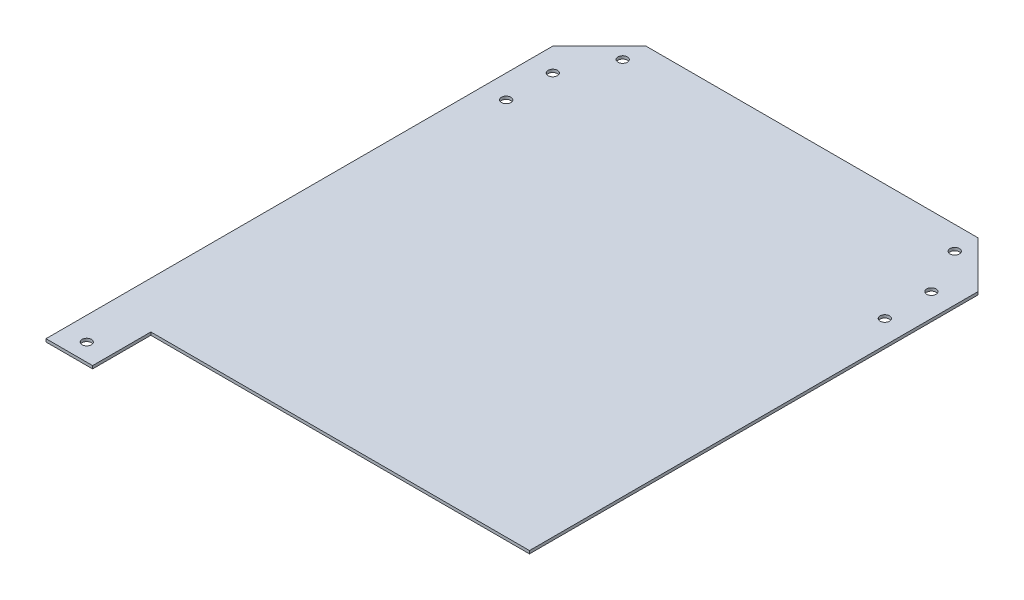
ISO-10303-21;
HEADER;
FILE_DESCRIPTION(('STEP AP214'),'2;1');
FILE_NAME('part.step','',(''),(''),'','','');
FILE_SCHEMA(('AUTOMOTIVE_DESIGN { 1 0 10303 214 1 1 1 1 }'));
ENDSEC;
DATA;
#1=APPLICATION_CONTEXT('core data for automotive mechanical design processes');
#2=APPLICATION_PROTOCOL_DEFINITION('international standard','automotive_design',2000,#1);
#3=PRODUCT_CONTEXT('',#1,'mechanical');
#4=PRODUCT('Part','Part','',(#3));
#5=PRODUCT_RELATED_PRODUCT_CATEGORY('part','',(#4));
#6=PRODUCT_DEFINITION_FORMATION('','',#4);
#7=PRODUCT_DEFINITION_CONTEXT('part definition',#1,'design');
#8=PRODUCT_DEFINITION('design','',#6,#7);
#9=PRODUCT_DEFINITION_SHAPE('','',#8);
#10=(LENGTH_UNIT() NAMED_UNIT(*) SI_UNIT(.MILLI.,.METRE.));
#11=(NAMED_UNIT(*) PLANE_ANGLE_UNIT() SI_UNIT($,.RADIAN.));
#12=(NAMED_UNIT(*) SI_UNIT($,.STERADIAN.) SOLID_ANGLE_UNIT());
#13=UNCERTAINTY_MEASURE_WITH_UNIT(LENGTH_MEASURE(1.E-05),#10,'distance_accuracy_value','');
#14=(GEOMETRIC_REPRESENTATION_CONTEXT(3) GLOBAL_UNCERTAINTY_ASSIGNED_CONTEXT((#13)) GLOBAL_UNIT_ASSIGNED_CONTEXT((#10,
#11,#12)) REPRESENTATION_CONTEXT('',''));
#15=CARTESIAN_POINT('',(0.,0.,0.));
#16=DIRECTION('',(0.,0.,1.));
#17=DIRECTION('',(1.,0.,0.));
#18=AXIS2_PLACEMENT_3D('',#15,#16,#17);
#19=CARTESIAN_POINT('',(-70.7565046605173,1.5875,3.62153533205063));
#20=DIRECTION('',(0.,0.,-1.));
#21=DIRECTION('',(-1.,0.,0.));
#22=AXIS2_PLACEMENT_3D('',#19,#20,#21);
#23=PLANE('',#22);
#24=DIRECTION('',(1.,0.,0.));
#25=VECTOR('',#24,1.);
#26=CARTESIAN_POINT('',(-70.7565046605173,0.,3.62153533205063));
#27=LINE('',#26,#25);
#28=CARTESIAN_POINT('',(-70.7565046605173,0.,3.62153533205063));
#29=VERTEX_POINT('',#28);
#30=CARTESIAN_POINT('',(135.6184958429,0.,3.62153533205063));
#31=VERTEX_POINT('',#30);
#32=EDGE_CURVE('E133',#29,#31,#27,.T.);
#33=ORIENTED_EDGE('',*,*,#32,.T.);
#34=DIRECTION('',(0.,-1.,0.));
#35=VECTOR('',#34,1.);
#36=CARTESIAN_POINT('',(135.6184958429,1.5875,3.62153533205063));
#37=LINE('',#36,#35);
#38=CARTESIAN_POINT('',(135.6184958429,1.5875,3.62153533205063));
#39=VERTEX_POINT('',#38);
#40=EDGE_CURVE('E11',#39,#31,#37,.T.);
#41=ORIENTED_EDGE('',*,*,#40,.F.);
#42=DIRECTION('',(1.,0.,0.));
#43=VECTOR('',#42,1.);
#44=CARTESIAN_POINT('',(-70.7565046605173,1.5875,3.62153533205063));
#45=LINE('',#44,#43);
#46=CARTESIAN_POINT('',(-70.7565046605173,1.5875,3.62153533205063));
#47=VERTEX_POINT('',#46);
#48=EDGE_CURVE('E148',#47,#39,#45,.T.);
#49=ORIENTED_EDGE('',*,*,#48,.F.);
#50=DIRECTION('',(0.,-1.,0.));
#51=VECTOR('',#50,1.);
#52=CARTESIAN_POINT('',(-70.7565046605173,1.5875,3.62153533205063));
#53=LINE('',#52,#51);
#54=EDGE_CURVE('E129',#47,#29,#53,.T.);
#55=ORIENTED_EDGE('',*,*,#54,.T.);
#56=EDGE_LOOP('',(#33,#41,#49,#55));
#57=FACE_BOUND('',#56,.T.);
#58=ADVANCED_FACE('F37',(#57),#23,.F.);
#59=CARTESIAN_POINT('',(135.6184958429,1.5875,3.62153533205063));
#60=DIRECTION('',(-1.,0.,0.));
#61=DIRECTION('',(0.,0.,1.));
#62=AXIS2_PLACEMENT_3D('',#59,#60,#61);
#63=PLANE('',#62);
#64=DIRECTION('',(0.,0.,-1.));
#65=VECTOR('',#64,1.);
#66=CARTESIAN_POINT('',(135.6184958429,0.,3.62153533205063));
#67=LINE('',#66,#65);
#68=CARTESIAN_POINT('',(135.6184958429,0.,-240.85346466795));
#69=VERTEX_POINT('',#68);
#70=EDGE_CURVE('E136',#31,#69,#67,.T.);
#71=ORIENTED_EDGE('',*,*,#70,.T.);
#72=DIRECTION('',(0.,-1.,0.));
#73=VECTOR('',#72,1.);
#74=CARTESIAN_POINT('',(135.6184958429,1.5875,-240.85346466795));
#75=LINE('',#74,#73);
#76=CARTESIAN_POINT('',(135.6184958429,1.5875,-240.85346466795));
#77=VERTEX_POINT('',#76);
#78=EDGE_CURVE('E45',#77,#69,#75,.T.);
#79=ORIENTED_EDGE('',*,*,#78,.F.);
#80=DIRECTION('',(0.,0.,-1.));
#81=VECTOR('',#80,1.);
#82=CARTESIAN_POINT('',(135.6184958429,1.5875,3.62153533205063));
#83=LINE('',#82,#81);
#84=EDGE_CURVE('E96',#39,#77,#83,.T.);
#85=ORIENTED_EDGE('',*,*,#84,.F.);
#86=ORIENTED_EDGE('',*,*,#40,.T.);
#87=EDGE_LOOP('',(#71,#79,#85,#86));
#88=FACE_BOUND('',#87,.T.);
#89=ADVANCED_FACE('F257',(#88),#63,.F.);
#90=CARTESIAN_POINT('',(135.6184958429,1.5875,-240.85346466795));
#91=DIRECTION('',(-0.707106781186544,0.,0.707106781186551));
#92=DIRECTION('',(0.707106781186551,0.,0.707106781186544));
#93=AXIS2_PLACEMENT_3D('',#90,#91,#92);
#94=PLANE('',#93);
#95=DIRECTION('',(-0.707106781186551,0.,-0.707106781186544));
#96=VECTOR('',#95,1.);
#97=CARTESIAN_POINT('',(135.6184958429,0.,-240.85346466795));
#98=LINE('',#97,#96);
#99=CARTESIAN_POINT('',(110.2184958429,0.,-266.25346466795));
#100=VERTEX_POINT('',#99);
#101=EDGE_CURVE('E139',#69,#100,#98,.T.);
#102=ORIENTED_EDGE('',*,*,#101,.T.);
#103=DIRECTION('',(0.,-1.,0.));
#104=VECTOR('',#103,1.);
#105=CARTESIAN_POINT('',(110.2184958429,1.5875,-266.25346466795));
#106=LINE('',#105,#104);
#107=CARTESIAN_POINT('',(110.2184958429,1.5875,-266.25346466795));
#108=VERTEX_POINT('',#107);
#109=EDGE_CURVE('E155',#108,#100,#106,.T.);
#110=ORIENTED_EDGE('',*,*,#109,.F.);
#111=DIRECTION('',(-0.707106781186551,0.,-0.707106781186544));
#112=VECTOR('',#111,1.);
#113=CARTESIAN_POINT('',(135.6184958429,1.5875,-240.85346466795));
#114=LINE('',#113,#112);
#115=EDGE_CURVE('E163',#77,#108,#114,.T.);
#116=ORIENTED_EDGE('',*,*,#115,.F.);
#117=ORIENTED_EDGE('',*,*,#78,.T.);
#118=EDGE_LOOP('',(#102,#110,#116,#117));
#119=FACE_BOUND('',#118,.T.);
#120=ADVANCED_FACE('F161',(#119),#94,.F.);
#121=CARTESIAN_POINT('',(110.2184958429,1.5875,-266.25346466795));
#122=DIRECTION('',(0.,0.,1.));
#123=DIRECTION('',(1.,0.,0.));
#124=AXIS2_PLACEMENT_3D('',#121,#122,#123);
#125=PLANE('',#124);
#126=DIRECTION('',(-1.,0.,0.));
#127=VECTOR('',#126,1.);
#128=CARTESIAN_POINT('',(110.2184958429,0.,-266.25346466795));
#129=LINE('',#128,#127);
#130=CARTESIAN_POINT('',(-70.7565047333945,0.,-266.25346466795));
#131=VERTEX_POINT('',#130);
#132=EDGE_CURVE('E141',#100,#131,#129,.T.);
#133=ORIENTED_EDGE('',*,*,#132,.T.);
#134=DIRECTION('',(0.,-1.,0.));
#135=VECTOR('',#134,1.);
#136=CARTESIAN_POINT('',(-70.7565047333945,1.5875,-266.25346466795));
#137=LINE('',#136,#135);
#138=CARTESIAN_POINT('',(-70.7565047333945,1.5875,-266.25346466795));
#139=VERTEX_POINT('',#138);
#140=EDGE_CURVE('E152',#139,#131,#137,.T.);
#141=ORIENTED_EDGE('',*,*,#140,.F.);
#142=DIRECTION('',(-1.,0.,0.));
#143=VECTOR('',#142,1.);
#144=CARTESIAN_POINT('',(110.2184958429,1.5875,-266.25346466795));
#145=LINE('',#144,#143);
#146=EDGE_CURVE('E175',#108,#139,#145,.T.);
#147=ORIENTED_EDGE('',*,*,#146,.F.);
#148=ORIENTED_EDGE('',*,*,#109,.T.);
#149=EDGE_LOOP('',(#133,#141,#147,#148));
#150=FACE_BOUND('',#149,.T.);
#151=ADVANCED_FACE('F171',(#150),#125,.F.);
#152=CARTESIAN_POINT('',(-96.1565047364325,1.5875,-240.853464664913));
#153=DIRECTION('',(0.707106781186535,0.,0.70710678118656));
#154=DIRECTION('',(0.70710678118656,0.,-0.707106781186535));
#155=AXIS2_PLACEMENT_3D('',#152,#153,#154);
#156=PLANE('',#155);
#157=DIRECTION('',(-0.70710678118656,0.,0.707106781186535));
#158=VECTOR('',#157,1.);
#159=CARTESIAN_POINT('',(-96.1565047364325,0.,-240.853464664913));
#160=LINE('',#159,#158);
#161=CARTESIAN_POINT('',(-96.1565047364325,0.,-240.853464664913));
#162=VERTEX_POINT('',#161);
#163=EDGE_CURVE('E143',#131,#162,#160,.T.);
#164=ORIENTED_EDGE('',*,*,#163,.T.);
#165=DIRECTION('',(0.,-1.,0.));
#166=VECTOR('',#165,1.);
#167=CARTESIAN_POINT('',(-96.1565047364325,1.5875,-240.853464664913));
#168=LINE('',#167,#166);
#169=CARTESIAN_POINT('',(-96.1565047364325,1.5875,-240.853464664913));
#170=VERTEX_POINT('',#169);
#171=EDGE_CURVE('E124',#170,#162,#168,.T.);
#172=ORIENTED_EDGE('',*,*,#171,.F.);
#173=DIRECTION('',(-0.70710678118656,0.,0.707106781186535));
#174=VECTOR('',#173,1.);
#175=CARTESIAN_POINT('',(-96.1565047364325,1.5875,-240.853464664913));
#176=LINE('',#175,#174);
#177=EDGE_CURVE('E115',#139,#170,#176,.T.);
#178=ORIENTED_EDGE('',*,*,#177,.F.);
#179=ORIENTED_EDGE('',*,*,#140,.T.);
#180=EDGE_LOOP('',(#164,#172,#178,#179));
#181=FACE_BOUND('',#180,.T.);
#182=ADVANCED_FACE('F174',(#181),#156,.F.);
#183=CARTESIAN_POINT('',(-96.1565047364325,1.5875,35.3715353320506));
#184=DIRECTION('',(1.,0.,0.));
#185=DIRECTION('',(0.,0.,-1.));
#186=AXIS2_PLACEMENT_3D('',#183,#184,#185);
#187=PLANE('',#186);
#188=DIRECTION('',(0.,0.,1.));
#189=VECTOR('',#188,1.);
#190=CARTESIAN_POINT('',(-96.1565047364325,0.,35.3715353320506));
#191=LINE('',#190,#189);
#192=CARTESIAN_POINT('',(-96.1565047364325,0.,35.3715353320506));
#193=VERTEX_POINT('',#192);
#194=EDGE_CURVE('E123',#162,#193,#191,.T.);
#195=ORIENTED_EDGE('',*,*,#194,.T.);
#196=DIRECTION('',(0.,-1.,0.));
#197=VECTOR('',#196,1.);
#198=CARTESIAN_POINT('',(-96.1565047364325,1.5875,35.3715353320506));
#199=LINE('',#198,#197);
#200=CARTESIAN_POINT('',(-96.1565047364325,1.5875,35.3715353320506));
#201=VERTEX_POINT('',#200);
#202=EDGE_CURVE('E120',#201,#193,#199,.T.);
#203=ORIENTED_EDGE('',*,*,#202,.F.);
#204=DIRECTION('',(0.,0.,1.));
#205=VECTOR('',#204,1.);
#206=CARTESIAN_POINT('',(-96.1565047364325,1.5875,35.3715353320506));
#207=LINE('',#206,#205);
#208=EDGE_CURVE('E109',#170,#201,#207,.T.);
#209=ORIENTED_EDGE('',*,*,#208,.F.);
#210=ORIENTED_EDGE('',*,*,#171,.T.);
#211=EDGE_LOOP('',(#195,#203,#209,#210));
#212=FACE_BOUND('',#211,.T.);
#213=ADVANCED_FACE('F121',(#212),#187,.F.);
#214=CARTESIAN_POINT('',(-70.7565046605173,1.5875,35.3715353320506));
#215=DIRECTION('',(0.,0.,-1.));
#216=DIRECTION('',(-1.,0.,0.));
#217=AXIS2_PLACEMENT_3D('',#214,#215,#216);
#218=PLANE('',#217);
#219=DIRECTION('',(1.,0.,0.));
#220=VECTOR('',#219,1.);
#221=CARTESIAN_POINT('',(-70.7565046605173,0.,35.3715353320506));
#222=LINE('',#221,#220);
#223=CARTESIAN_POINT('',(-70.7565046605173,0.,35.3715353320506));
#224=VERTEX_POINT('',#223);
#225=EDGE_CURVE('E82',#193,#224,#222,.T.);
#226=ORIENTED_EDGE('',*,*,#225,.T.);
#227=DIRECTION('',(0.,-1.,0.));
#228=VECTOR('',#227,1.);
#229=CARTESIAN_POINT('',(-70.7565046605173,1.5875,35.3715353320506));
#230=LINE('',#229,#228);
#231=CARTESIAN_POINT('',(-70.7565046605173,1.5875,35.3715353320506));
#232=VERTEX_POINT('',#231);
#233=EDGE_CURVE('E125',#232,#224,#230,.T.);
#234=ORIENTED_EDGE('',*,*,#233,.F.);
#235=DIRECTION('',(1.,0.,0.));
#236=VECTOR('',#235,1.);
#237=CARTESIAN_POINT('',(-70.7565046605173,1.5875,35.3715353320506));
#238=LINE('',#237,#236);
#239=EDGE_CURVE('E113',#201,#232,#238,.T.);
#240=ORIENTED_EDGE('',*,*,#239,.F.);
#241=ORIENTED_EDGE('',*,*,#202,.T.);
#242=EDGE_LOOP('',(#226,#234,#240,#241));
#243=FACE_BOUND('',#242,.T.);
#244=ADVANCED_FACE('F127',(#243),#218,.F.);
#245=CARTESIAN_POINT('',(-70.7565046605173,1.5875,3.62153533205063));
#246=DIRECTION('',(-1.,0.,0.));
#247=DIRECTION('',(0.,0.,1.));
#248=AXIS2_PLACEMENT_3D('',#245,#246,#247);
#249=PLANE('',#248);
#250=DIRECTION('',(0.,0.,-1.));
#251=VECTOR('',#250,1.);
#252=CARTESIAN_POINT('',(-70.7565046605173,0.,3.62153533205063));
#253=LINE('',#252,#251);
#254=EDGE_CURVE('E88',#224,#29,#253,.T.);
#255=ORIENTED_EDGE('',*,*,#254,.T.);
#256=ORIENTED_EDGE('',*,*,#54,.F.);
#257=DIRECTION('',(0.,0.,-1.));
#258=VECTOR('',#257,1.);
#259=CARTESIAN_POINT('',(-70.7565046605173,1.5875,3.62153533205063));
#260=LINE('',#259,#258);
#261=EDGE_CURVE('E53',#232,#47,#260,.T.);
#262=ORIENTED_EDGE('',*,*,#261,.F.);
#263=ORIENTED_EDGE('',*,*,#233,.T.);
#264=EDGE_LOOP('',(#255,#256,#262,#263));
#265=FACE_BOUND('',#264,.T.);
#266=ADVANCED_FACE('F227',(#265),#249,.F.);
#267=CARTESIAN_POINT('',(0.,1.5875,0.));
#268=DIRECTION('',(0.,1.,0.));
#269=DIRECTION('',(0.,0.,1.));
#270=AXIS2_PLACEMENT_3D('',#267,#268,#269);
#271=PLANE('',#270);
#272=CARTESIAN_POINT('',(-83.4565047045481,1.5875,25.8465348255686));
#273=DIRECTION('',(0.,1.,0.));
#274=DIRECTION('',(0.,0.,1.));
#275=AXIS2_PLACEMENT_3D('',#272,#273,#274);
#276=CIRCLE('',#275,2.55269999999999);
#277=CARTESIAN_POINT('',(-83.4565047045481,1.5875,28.3992348255686));
#278=VERTEX_POINT('',#277);
#279=EDGE_CURVE('E219',#278,#278,#276,.T.);
#280=ORIENTED_EDGE('',*,*,#279,.F.);
#281=EDGE_LOOP('',(#280));
#282=FACE_BOUND('',#281,.T.);
#283=CARTESIAN_POINT('',(-83.4565047318771,1.5875,-202.753465682431));
#284=DIRECTION('',(0.,1.,0.));
#285=DIRECTION('',(0.,0.,1.));
#286=AXIS2_PLACEMENT_3D('',#283,#284,#285);
#287=CIRCLE('',#286,2.55269999999999);
#288=CARTESIAN_POINT('',(-83.4565047318771,1.5875,-200.200765682431));
#289=VERTEX_POINT('',#288);
#290=EDGE_CURVE('E213',#289,#289,#287,.T.);
#291=ORIENTED_EDGE('',*,*,#290,.F.);
#292=EDGE_LOOP('',(#291));
#293=FACE_BOUND('',#292,.T.);
#294=CARTESIAN_POINT('',(-83.4565047318771,1.5875,-228.153465682431));
#295=DIRECTION('',(0.,1.,0.));
#296=DIRECTION('',(0.,0.,1.));
#297=AXIS2_PLACEMENT_3D('',#294,#295,#296);
#298=CIRCLE('',#297,2.55269999999999);
#299=CARTESIAN_POINT('',(-83.4565047318771,1.5875,-225.600765682431));
#300=VERTEX_POINT('',#299);
#301=EDGE_CURVE('E207',#300,#300,#298,.T.);
#302=ORIENTED_EDGE('',*,*,#301,.F.);
#303=EDGE_LOOP('',(#302));
#304=FACE_BOUND('',#303,.T.);
#305=CARTESIAN_POINT('',(-70.7565047318771,1.5875,-253.553465682431));
#306=DIRECTION('',(0.,1.,0.));
#307=DIRECTION('',(0.,0.,1.));
#308=AXIS2_PLACEMENT_3D('',#305,#306,#307);
#309=CIRCLE('',#308,2.55269999999999);
#310=CARTESIAN_POINT('',(-70.7565047318771,1.5875,-251.000765682431));
#311=VERTEX_POINT('',#310);
#312=EDGE_CURVE('E201',#311,#311,#309,.T.);
#313=ORIENTED_EDGE('',*,*,#312,.F.);
#314=EDGE_LOOP('',(#313));
#315=FACE_BOUND('',#314,.T.);
#316=CARTESIAN_POINT('',(122.9184958429,1.5875,-202.75346466795));
#317=DIRECTION('',(0.,1.,0.));
#318=DIRECTION('',(0.,0.,1.));
#319=AXIS2_PLACEMENT_3D('',#316,#317,#318);
#320=CIRCLE('',#319,2.55269999999999);
#321=CARTESIAN_POINT('',(122.9184958429,1.5875,-200.20076466795));
#322=VERTEX_POINT('',#321);
#323=EDGE_CURVE('E195',#322,#322,#320,.T.);
#324=ORIENTED_EDGE('',*,*,#323,.F.);
#325=EDGE_LOOP('',(#324));
#326=FACE_BOUND('',#325,.T.);
#327=CARTESIAN_POINT('',(122.9184958429,1.5875,-228.15346466795));
#328=DIRECTION('',(0.,1.,0.));
#329=DIRECTION('',(0.,0.,1.));
#330=AXIS2_PLACEMENT_3D('',#327,#328,#329);
#331=CIRCLE('',#330,2.55269999999999);
#332=CARTESIAN_POINT('',(122.9184958429,1.5875,-225.60076466795));
#333=VERTEX_POINT('',#332);
#334=EDGE_CURVE('E189',#333,#333,#331,.T.);
#335=ORIENTED_EDGE('',*,*,#334,.F.);
#336=EDGE_LOOP('',(#335));
#337=FACE_BOUND('',#336,.T.);
#338=CARTESIAN_POINT('',(110.2184958429,1.5875,-253.55346466795));
#339=DIRECTION('',(0.,1.,0.));
#340=DIRECTION('',(0.,0.,1.));
#341=AXIS2_PLACEMENT_3D('',#338,#339,#340);
#342=CIRCLE('',#341,2.55269999999999);
#343=CARTESIAN_POINT('',(110.2184958429,1.5875,-251.00076466795));
#344=VERTEX_POINT('',#343);
#345=EDGE_CURVE('E183',#344,#344,#342,.T.);
#346=ORIENTED_EDGE('',*,*,#345,.F.);
#347=EDGE_LOOP('',(#346));
#348=FACE_BOUND('',#347,.T.);
#349=ORIENTED_EDGE('',*,*,#48,.T.);
#350=ORIENTED_EDGE('',*,*,#84,.T.);
#351=ORIENTED_EDGE('',*,*,#115,.T.);
#352=ORIENTED_EDGE('',*,*,#146,.T.);
#353=ORIENTED_EDGE('',*,*,#177,.T.);
#354=ORIENTED_EDGE('',*,*,#208,.T.);
#355=ORIENTED_EDGE('',*,*,#239,.T.);
#356=ORIENTED_EDGE('',*,*,#261,.T.);
#357=EDGE_LOOP('',(#349,#350,#351,#352,#353,#354,#355,#356));
#358=FACE_BOUND('',#357,.T.);
#359=ADVANCED_FACE('F111',(#282,#293,#304,#315,#326,#337,#348,#358),#271,.T.);
#360=CARTESIAN_POINT('',(0.,0.,0.));
#361=DIRECTION('',(0.,1.,0.));
#362=DIRECTION('',(0.,0.,1.));
#363=AXIS2_PLACEMENT_3D('',#360,#361,#362);
#364=PLANE('',#363);
#365=CARTESIAN_POINT('',(-83.4565047045481,0.,25.8465348255686));
#366=DIRECTION('',(0.,1.,0.));
#367=DIRECTION('',(0.,0.,1.));
#368=AXIS2_PLACEMENT_3D('',#365,#366,#367);
#369=CIRCLE('',#368,2.55269999999999);
#370=CARTESIAN_POINT('',(-83.4565047045481,0.,28.3992348255686));
#371=VERTEX_POINT('',#370);
#372=EDGE_CURVE('E216',#371,#371,#369,.T.);
#373=ORIENTED_EDGE('',*,*,#372,.T.);
#374=EDGE_LOOP('',(#373));
#375=FACE_BOUND('',#374,.T.);
#376=CARTESIAN_POINT('',(-83.4565047318771,0.,-202.753465682431));
#377=DIRECTION('',(0.,1.,0.));
#378=DIRECTION('',(0.,0.,1.));
#379=AXIS2_PLACEMENT_3D('',#376,#377,#378);
#380=CIRCLE('',#379,2.55269999999999);
#381=CARTESIAN_POINT('',(-83.4565047318771,0.,-200.200765682431));
#382=VERTEX_POINT('',#381);
#383=EDGE_CURVE('E210',#382,#382,#380,.T.);
#384=ORIENTED_EDGE('',*,*,#383,.T.);
#385=EDGE_LOOP('',(#384));
#386=FACE_BOUND('',#385,.T.);
#387=CARTESIAN_POINT('',(-83.4565047318771,0.,-228.153465682431));
#388=DIRECTION('',(0.,1.,0.));
#389=DIRECTION('',(0.,0.,1.));
#390=AXIS2_PLACEMENT_3D('',#387,#388,#389);
#391=CIRCLE('',#390,2.55269999999999);
#392=CARTESIAN_POINT('',(-83.4565047318771,0.,-225.600765682431));
#393=VERTEX_POINT('',#392);
#394=EDGE_CURVE('E204',#393,#393,#391,.T.);
#395=ORIENTED_EDGE('',*,*,#394,.T.);
#396=EDGE_LOOP('',(#395));
#397=FACE_BOUND('',#396,.T.);
#398=CARTESIAN_POINT('',(-70.7565047318771,0.,-253.553465682431));
#399=DIRECTION('',(0.,1.,0.));
#400=DIRECTION('',(0.,0.,1.));
#401=AXIS2_PLACEMENT_3D('',#398,#399,#400);
#402=CIRCLE('',#401,2.55269999999999);
#403=CARTESIAN_POINT('',(-70.7565047318771,0.,-251.000765682431));
#404=VERTEX_POINT('',#403);
#405=EDGE_CURVE('E198',#404,#404,#402,.T.);
#406=ORIENTED_EDGE('',*,*,#405,.T.);
#407=EDGE_LOOP('',(#406));
#408=FACE_BOUND('',#407,.T.);
#409=CARTESIAN_POINT('',(122.9184958429,0.,-202.75346466795));
#410=DIRECTION('',(0.,1.,0.));
#411=DIRECTION('',(0.,0.,1.));
#412=AXIS2_PLACEMENT_3D('',#409,#410,#411);
#413=CIRCLE('',#412,2.55269999999999);
#414=CARTESIAN_POINT('',(122.9184958429,0.,-200.20076466795));
#415=VERTEX_POINT('',#414);
#416=EDGE_CURVE('E192',#415,#415,#413,.T.);
#417=ORIENTED_EDGE('',*,*,#416,.T.);
#418=EDGE_LOOP('',(#417));
#419=FACE_BOUND('',#418,.T.);
#420=CARTESIAN_POINT('',(122.9184958429,0.,-228.15346466795));
#421=DIRECTION('',(0.,1.,0.));
#422=DIRECTION('',(0.,0.,1.));
#423=AXIS2_PLACEMENT_3D('',#420,#421,#422);
#424=CIRCLE('',#423,2.55269999999999);
#425=CARTESIAN_POINT('',(122.9184958429,0.,-225.60076466795));
#426=VERTEX_POINT('',#425);
#427=EDGE_CURVE('E186',#426,#426,#424,.T.);
#428=ORIENTED_EDGE('',*,*,#427,.T.);
#429=EDGE_LOOP('',(#428));
#430=FACE_BOUND('',#429,.T.);
#431=CARTESIAN_POINT('',(110.2184958429,0.,-253.55346466795));
#432=DIRECTION('',(0.,1.,0.));
#433=DIRECTION('',(0.,0.,1.));
#434=AXIS2_PLACEMENT_3D('',#431,#432,#433);
#435=CIRCLE('',#434,2.55269999999999);
#436=CARTESIAN_POINT('',(110.2184958429,0.,-251.00076466795));
#437=VERTEX_POINT('',#436);
#438=EDGE_CURVE('E137',#437,#437,#435,.T.);
#439=ORIENTED_EDGE('',*,*,#438,.T.);
#440=EDGE_LOOP('',(#439));
#441=FACE_BOUND('',#440,.T.);
#442=ORIENTED_EDGE('',*,*,#32,.F.);
#443=ORIENTED_EDGE('',*,*,#254,.F.);
#444=ORIENTED_EDGE('',*,*,#225,.F.);
#445=ORIENTED_EDGE('',*,*,#194,.F.);
#446=ORIENTED_EDGE('',*,*,#163,.F.);
#447=ORIENTED_EDGE('',*,*,#132,.F.);
#448=ORIENTED_EDGE('',*,*,#101,.F.);
#449=ORIENTED_EDGE('',*,*,#70,.F.);
#450=EDGE_LOOP('',(#442,#443,#444,#445,#446,#447,#448,#449));
#451=FACE_BOUND('',#450,.T.);
#452=ADVANCED_FACE('F167',(#375,#386,#397,#408,#419,#430,#441,#451),#364,.F.);
#453=CARTESIAN_POINT('',(110.2184958429,1.5875,-253.55346466795));
#454=DIRECTION('',(0.,1.,0.));
#455=DIRECTION('',(0.,0.,1.));
#456=AXIS2_PLACEMENT_3D('',#453,#454,#455);
#457=CYLINDRICAL_SURFACE('',#456,2.55269999999999);
#458=ORIENTED_EDGE('',*,*,#438,.F.);
#459=EDGE_LOOP('',(#458));
#460=FACE_BOUND('',#459,.T.);
#461=ORIENTED_EDGE('',*,*,#345,.T.);
#462=EDGE_LOOP('',(#461));
#463=FACE_BOUND('',#462,.T.);
#464=ADVANCED_FACE('F241',(#460,#463),#457,.F.);
#465=CARTESIAN_POINT('',(122.9184958429,1.5875,-228.15346466795));
#466=DIRECTION('',(0.,1.,0.));
#467=DIRECTION('',(0.,0.,1.));
#468=AXIS2_PLACEMENT_3D('',#465,#466,#467);
#469=CYLINDRICAL_SURFACE('',#468,2.55269999999999);
#470=ORIENTED_EDGE('',*,*,#427,.F.);
#471=EDGE_LOOP('',(#470));
#472=FACE_BOUND('',#471,.T.);
#473=ORIENTED_EDGE('',*,*,#334,.T.);
#474=EDGE_LOOP('',(#473));
#475=FACE_BOUND('',#474,.T.);
#476=ADVANCED_FACE('F243',(#472,#475),#469,.F.);
#477=CARTESIAN_POINT('',(122.9184958429,1.5875,-202.75346466795));
#478=DIRECTION('',(0.,1.,0.));
#479=DIRECTION('',(0.,0.,1.));
#480=AXIS2_PLACEMENT_3D('',#477,#478,#479);
#481=CYLINDRICAL_SURFACE('',#480,2.55269999999999);
#482=ORIENTED_EDGE('',*,*,#416,.F.);
#483=EDGE_LOOP('',(#482));
#484=FACE_BOUND('',#483,.T.);
#485=ORIENTED_EDGE('',*,*,#323,.T.);
#486=EDGE_LOOP('',(#485));
#487=FACE_BOUND('',#486,.T.);
#488=ADVANCED_FACE('F250',(#484,#487),#481,.F.);
#489=CARTESIAN_POINT('',(-70.7565047318771,1.5875,-253.553465682431));
#490=DIRECTION('',(0.,1.,0.));
#491=DIRECTION('',(0.,0.,1.));
#492=AXIS2_PLACEMENT_3D('',#489,#490,#491);
#493=CYLINDRICAL_SURFACE('',#492,2.55269999999999);
#494=ORIENTED_EDGE('',*,*,#405,.F.);
#495=EDGE_LOOP('',(#494));
#496=FACE_BOUND('',#495,.T.);
#497=ORIENTED_EDGE('',*,*,#312,.T.);
#498=EDGE_LOOP('',(#497));
#499=FACE_BOUND('',#498,.T.);
#500=ADVANCED_FACE('F339',(#496,#499),#493,.F.);
#501=CARTESIAN_POINT('',(-83.4565047318771,1.5875,-228.153465682431));
#502=DIRECTION('',(0.,1.,0.));
#503=DIRECTION('',(0.,0.,1.));
#504=AXIS2_PLACEMENT_3D('',#501,#502,#503);
#505=CYLINDRICAL_SURFACE('',#504,2.55269999999999);
#506=ORIENTED_EDGE('',*,*,#394,.F.);
#507=EDGE_LOOP('',(#506));
#508=FACE_BOUND('',#507,.T.);
#509=ORIENTED_EDGE('',*,*,#301,.T.);
#510=EDGE_LOOP('',(#509));
#511=FACE_BOUND('',#510,.T.);
#512=ADVANCED_FACE('F350',(#508,#511),#505,.F.);
#513=CARTESIAN_POINT('',(-83.4565047318771,1.5875,-202.753465682431));
#514=DIRECTION('',(0.,1.,0.));
#515=DIRECTION('',(0.,0.,1.));
#516=AXIS2_PLACEMENT_3D('',#513,#514,#515);
#517=CYLINDRICAL_SURFACE('',#516,2.55269999999999);
#518=ORIENTED_EDGE('',*,*,#383,.F.);
#519=EDGE_LOOP('',(#518));
#520=FACE_BOUND('',#519,.T.);
#521=ORIENTED_EDGE('',*,*,#290,.T.);
#522=EDGE_LOOP('',(#521));
#523=FACE_BOUND('',#522,.T.);
#524=ADVANCED_FACE('F361',(#520,#523),#517,.F.);
#525=CARTESIAN_POINT('',(-83.4565047045481,1.5875,25.8465348255686));
#526=DIRECTION('',(0.,1.,0.));
#527=DIRECTION('',(0.,0.,1.));
#528=AXIS2_PLACEMENT_3D('',#525,#526,#527);
#529=CYLINDRICAL_SURFACE('',#528,2.55269999999999);
#530=ORIENTED_EDGE('',*,*,#372,.F.);
#531=EDGE_LOOP('',(#530));
#532=FACE_BOUND('',#531,.T.);
#533=ORIENTED_EDGE('',*,*,#279,.T.);
#534=EDGE_LOOP('',(#533));
#535=FACE_BOUND('',#534,.T.);
#536=ADVANCED_FACE('F223',(#532,#535),#529,.F.);
#537=CLOSED_SHELL('',(#58,#89,#120,#151,#182,#213,#244,#266,#359,#452,#464,#476,#488,#500,#512,
#524,#536));
#538=MANIFOLD_SOLID_BREP('B2',#537);
#539=ADVANCED_BREP_SHAPE_REPRESENTATION('',(#18,#538),#14);
#540=SHAPE_DEFINITION_REPRESENTATION(#9,#539);
ENDSEC;
END-ISO-10303-21;
